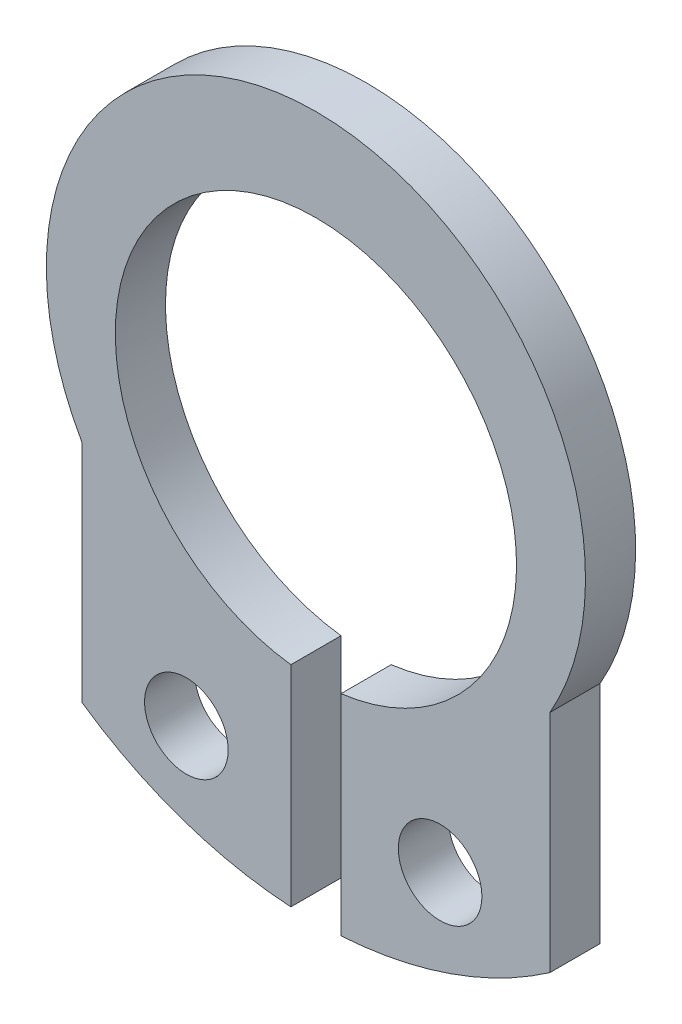
ISO-10303-21;
HEADER;
FILE_DESCRIPTION(('STEP AP214'),'2;1');
FILE_NAME('part.step','',(''),(''),'','','');
FILE_SCHEMA(('AUTOMOTIVE_DESIGN { 1 0 10303 214 1 1 1 1 }'));
ENDSEC;
DATA;
#1=APPLICATION_CONTEXT('core data for automotive mechanical design processes');
#2=APPLICATION_PROTOCOL_DEFINITION('international standard','automotive_design',2000,#1);
#3=PRODUCT_CONTEXT('',#1,'mechanical');
#4=PRODUCT('Part','Part','',(#3));
#5=PRODUCT_RELATED_PRODUCT_CATEGORY('part','',(#4));
#6=PRODUCT_DEFINITION_FORMATION('','',#4);
#7=PRODUCT_DEFINITION_CONTEXT('part definition',#1,'design');
#8=PRODUCT_DEFINITION('design','',#6,#7);
#9=PRODUCT_DEFINITION_SHAPE('','',#8);
#10=(LENGTH_UNIT() NAMED_UNIT(*) SI_UNIT(.MILLI.,.METRE.));
#11=(NAMED_UNIT(*) PLANE_ANGLE_UNIT() SI_UNIT($,.RADIAN.));
#12=(NAMED_UNIT(*) SI_UNIT($,.STERADIAN.) SOLID_ANGLE_UNIT());
#13=UNCERTAINTY_MEASURE_WITH_UNIT(LENGTH_MEASURE(1.E-05),#10,'distance_accuracy_value','');
#14=(GEOMETRIC_REPRESENTATION_CONTEXT(3) GLOBAL_UNCERTAINTY_ASSIGNED_CONTEXT((#13)) GLOBAL_UNIT_ASSIGNED_CONTEXT((#10,
#11,#12)) REPRESENTATION_CONTEXT('',''));
#15=CARTESIAN_POINT('',(0.,0.,0.));
#16=DIRECTION('',(0.,0.,1.));
#17=DIRECTION('',(1.,0.,0.));
#18=AXIS2_PLACEMENT_3D('',#15,#16,#17);
#19=CARTESIAN_POINT('',(0.153061224489797,1.55676256731012,0.));
#20=DIRECTION('',(0.,0.,1.));
#21=DIRECTION('',(1.,0.,0.));
#22=AXIS2_PLACEMENT_3D('',#19,#20,#21);
#23=PLANE('',#22);
#24=CARTESIAN_POINT('',(0.153061224489797,2.49531005319132,0.));
#25=DIRECTION('',(0.,0.,1.));
#26=DIRECTION('',(1.,0.,0.));
#27=AXIS2_PLACEMENT_3D('',#24,#25,#26);
#28=CIRCLE('',#27,2.4);
#29=CARTESIAN_POINT('',(0.453061224489797,0.114133873233191,0.));
#30=VERTEX_POINT('',#29);
#31=CARTESIAN_POINT('',(-0.146938775510204,0.114133873233191,0.));
#32=VERTEX_POINT('',#31);
#33=EDGE_CURVE('E10',#30,#32,#28,.T.);
#34=ORIENTED_EDGE('',*,*,#33,.T.);
#35=DIRECTION('',(0.,1.,0.));
#36=VECTOR('',#35,1.);
#37=CARTESIAN_POINT('',(-0.146938775510204,-2.39549765106367,0.));
#38=LINE('',#37,#36);
#39=CARTESIAN_POINT('',(-0.146938775510204,-2.39549765106367,0.));
#40=VERTEX_POINT('',#39);
#41=EDGE_CURVE('E120',#40,#32,#38,.T.);
#42=ORIENTED_EDGE('',*,*,#41,.F.);
#43=CARTESIAN_POINT('',(0.153061224489797,2.49531005319132,0.));
#44=DIRECTION('',(0.,0.,1.));
#45=DIRECTION('',(1.,0.,0.));
#46=AXIS2_PLACEMENT_3D('',#43,#44,#45);
#47=CIRCLE('',#46,4.9);
#48=CARTESIAN_POINT('',(-2.64693877551021,-1.5258837993853,0.));
#49=VERTEX_POINT('',#48);
#50=EDGE_CURVE('E107',#49,#40,#47,.T.);
#51=ORIENTED_EDGE('',*,*,#50,.F.);
#52=DIRECTION('',(0.,1.,0.));
#53=VECTOR('',#52,1.);
#54=CARTESIAN_POINT('',(-2.64693877551021,-1.5258837993853,0.));
#55=LINE('',#54,#53);
#56=CARTESIAN_POINT('',(-2.64693877551021,1.1701147526108,0.));
#57=VERTEX_POINT('',#56);
#58=EDGE_CURVE('E146',#49,#57,#55,.T.);
#59=ORIENTED_EDGE('',*,*,#58,.T.);
#60=CARTESIAN_POINT('',(0.153061224489797,2.77031005319132,0.));
#61=DIRECTION('',(0.,0.,1.));
#62=DIRECTION('',(1.,0.,0.));
#63=AXIS2_PLACEMENT_3D('',#60,#61,#62);
#64=CIRCLE('',#63,3.225);
#65=CARTESIAN_POINT('',(2.95306122448979,1.17011475261079,0.));
#66=VERTEX_POINT('',#65);
#67=EDGE_CURVE('E125',#66,#57,#64,.T.);
#68=ORIENTED_EDGE('',*,*,#67,.F.);
#69=DIRECTION('',(0.,1.,0.));
#70=VECTOR('',#69,1.);
#71=CARTESIAN_POINT('',(2.95306122448979,-1.52588379938531,0.));
#72=LINE('',#71,#70);
#73=CARTESIAN_POINT('',(2.95306122448979,-1.5258837993853,0.));
#74=VERTEX_POINT('',#73);
#75=EDGE_CURVE('E163',#74,#66,#72,.T.);
#76=ORIENTED_EDGE('',*,*,#75,.F.);
#77=CARTESIAN_POINT('',(0.153061224489797,2.49531005319132,0.));
#78=DIRECTION('',(0.,0.,1.));
#79=DIRECTION('',(1.,0.,0.));
#80=AXIS2_PLACEMENT_3D('',#77,#78,#79);
#81=CIRCLE('',#80,4.9);
#82=CARTESIAN_POINT('',(0.453061224489797,-2.39549765106367,0.));
#83=VERTEX_POINT('',#82);
#84=EDGE_CURVE('E174',#83,#74,#81,.T.);
#85=ORIENTED_EDGE('',*,*,#84,.F.);
#86=DIRECTION('',(0.,1.,0.));
#87=VECTOR('',#86,1.);
#88=CARTESIAN_POINT('',(0.453061224489797,-2.39549765106367,0.));
#89=LINE('',#88,#87);
#90=EDGE_CURVE('E184',#83,#30,#89,.T.);
#91=ORIENTED_EDGE('',*,*,#90,.T.);
#92=EDGE_LOOP('',(#34,#42,#51,#59,#68,#76,#85,#91));
#93=FACE_BOUND('',#92,.T.);
#94=CARTESIAN_POINT('',(-1.3969387755102,-1.14549765106367,0.));
#95=DIRECTION('',(0.,0.,1.));
#96=DIRECTION('',(1.,0.,0.));
#97=AXIS2_PLACEMENT_3D('',#94,#95,#96);
#98=CIRCLE('',#97,0.5);
#99=CARTESIAN_POINT('',(-0.896938775510204,-1.14549765106367,0.));
#100=VERTEX_POINT('',#99);
#101=EDGE_CURVE('E95',#100,#100,#98,.T.);
#102=ORIENTED_EDGE('',*,*,#101,.T.);
#103=EDGE_LOOP('',(#102));
#104=FACE_BOUND('',#103,.T.);
#105=CARTESIAN_POINT('',(1.63877551020408,-1.14549765106367,0.));
#106=DIRECTION('',(0.,0.,1.));
#107=DIRECTION('',(1.,0.,0.));
#108=AXIS2_PLACEMENT_3D('',#105,#106,#107);
#109=CIRCLE('',#108,0.5);
#110=CARTESIAN_POINT('',(2.13877551020408,-1.14549765106367,0.));
#111=VERTEX_POINT('',#110);
#112=EDGE_CURVE('E108',#111,#111,#109,.T.);
#113=ORIENTED_EDGE('',*,*,#112,.T.);
#114=EDGE_LOOP('',(#113));
#115=FACE_BOUND('',#114,.T.);
#116=ADVANCED_FACE('F16',(#93,#104,#115),#23,.F.);
#117=CARTESIAN_POINT('',(0.153061224489797,1.55676256731012,0.6));
#118=DIRECTION('',(0.,0.,1.));
#119=DIRECTION('',(1.,0.,0.));
#120=AXIS2_PLACEMENT_3D('',#117,#118,#119);
#121=PLANE('',#120);
#122=DIRECTION('',(0.,-1.,0.));
#123=VECTOR('',#122,1.);
#124=CARTESIAN_POINT('',(-0.146938775510204,-2.39549765106367,0.6));
#125=LINE('',#124,#123);
#126=CARTESIAN_POINT('',(-0.146938775510204,0.114133873233191,0.6));
#127=VERTEX_POINT('',#126);
#128=CARTESIAN_POINT('',(-0.146938775510204,-2.39549765106367,0.6));
#129=VERTEX_POINT('',#128);
#130=EDGE_CURVE('E94',#127,#129,#125,.T.);
#131=ORIENTED_EDGE('',*,*,#130,.F.);
#132=CARTESIAN_POINT('',(0.153061224489797,2.49531005319132,0.6));
#133=DIRECTION('',(0.,0.,1.));
#134=DIRECTION('',(1.,0.,0.));
#135=AXIS2_PLACEMENT_3D('',#132,#133,#134);
#136=CIRCLE('',#135,2.4);
#137=CARTESIAN_POINT('',(0.453061224489797,0.114133873233191,0.6));
#138=VERTEX_POINT('',#137);
#139=EDGE_CURVE('E25',#138,#127,#136,.T.);
#140=ORIENTED_EDGE('',*,*,#139,.F.);
#141=DIRECTION('',(0.,1.,0.));
#142=VECTOR('',#141,1.);
#143=CARTESIAN_POINT('',(0.453061224489797,-2.39549765106367,0.6));
#144=LINE('',#143,#142);
#145=CARTESIAN_POINT('',(0.453061224489797,-2.39549765106367,0.6));
#146=VERTEX_POINT('',#145);
#147=EDGE_CURVE('E177',#146,#138,#144,.T.);
#148=ORIENTED_EDGE('',*,*,#147,.F.);
#149=CARTESIAN_POINT('',(0.153061224489797,2.49531005319132,0.6));
#150=DIRECTION('',(0.,0.,-1.));
#151=DIRECTION('',(1.,0.,0.));
#152=AXIS2_PLACEMENT_3D('',#149,#150,#151);
#153=CIRCLE('',#152,4.9);
#154=CARTESIAN_POINT('',(2.95306122448979,-1.5258837993853,0.6));
#155=VERTEX_POINT('',#154);
#156=EDGE_CURVE('E166',#155,#146,#153,.T.);
#157=ORIENTED_EDGE('',*,*,#156,.F.);
#158=DIRECTION('',(0.,-1.,0.));
#159=VECTOR('',#158,1.);
#160=CARTESIAN_POINT('',(2.95306122448979,-1.52588379938531,0.6));
#161=LINE('',#160,#159);
#162=CARTESIAN_POINT('',(2.95306122448979,1.17011475261079,0.6));
#163=VERTEX_POINT('',#162);
#164=EDGE_CURVE('E155',#163,#155,#161,.T.);
#165=ORIENTED_EDGE('',*,*,#164,.F.);
#166=CARTESIAN_POINT('',(0.153061224489797,2.77031005319132,0.6));
#167=DIRECTION('',(0.,0.,-1.));
#168=DIRECTION('',(1.,0.,0.));
#169=AXIS2_PLACEMENT_3D('',#166,#167,#168);
#170=CIRCLE('',#169,3.225);
#171=CARTESIAN_POINT('',(-2.64693877551021,1.1701147526108,0.6));
#172=VERTEX_POINT('',#171);
#173=EDGE_CURVE('E126',#172,#163,#170,.T.);
#174=ORIENTED_EDGE('',*,*,#173,.F.);
#175=DIRECTION('',(0.,1.,0.));
#176=VECTOR('',#175,1.);
#177=CARTESIAN_POINT('',(-2.64693877551021,-1.5258837993853,0.6));
#178=LINE('',#177,#176);
#179=CARTESIAN_POINT('',(-2.64693877551021,-1.5258837993853,0.6));
#180=VERTEX_POINT('',#179);
#181=EDGE_CURVE('E111',#180,#172,#178,.T.);
#182=ORIENTED_EDGE('',*,*,#181,.F.);
#183=CARTESIAN_POINT('',(0.153061224489797,2.49531005319132,0.6));
#184=DIRECTION('',(0.,0.,-1.));
#185=DIRECTION('',(1.,0.,0.));
#186=AXIS2_PLACEMENT_3D('',#183,#184,#185);
#187=CIRCLE('',#186,4.9);
#188=EDGE_CURVE('E135',#129,#180,#187,.T.);
#189=ORIENTED_EDGE('',*,*,#188,.F.);
#190=EDGE_LOOP('',(#131,#140,#148,#157,#165,#174,#182,#189));
#191=FACE_BOUND('',#190,.T.);
#192=CARTESIAN_POINT('',(-1.3969387755102,-1.14549765106367,0.6));
#193=DIRECTION('',(0.,0.,-1.));
#194=DIRECTION('',(1.,0.,0.));
#195=AXIS2_PLACEMENT_3D('',#192,#193,#194);
#196=CIRCLE('',#195,0.5);
#197=CARTESIAN_POINT('',(-0.896938775510204,-1.14549765106367,0.6));
#198=VERTEX_POINT('',#197);
#199=EDGE_CURVE('E90',#198,#198,#196,.T.);
#200=ORIENTED_EDGE('',*,*,#199,.T.);
#201=EDGE_LOOP('',(#200));
#202=FACE_BOUND('',#201,.T.);
#203=CARTESIAN_POINT('',(1.63877551020408,-1.14549765106367,0.6));
#204=DIRECTION('',(0.,0.,-1.));
#205=DIRECTION('',(1.,0.,0.));
#206=AXIS2_PLACEMENT_3D('',#203,#204,#205);
#207=CIRCLE('',#206,0.5);
#208=CARTESIAN_POINT('',(2.13877551020408,-1.14549765106367,0.6));
#209=VERTEX_POINT('',#208);
#210=EDGE_CURVE('E103',#209,#209,#207,.T.);
#211=ORIENTED_EDGE('',*,*,#210,.T.);
#212=EDGE_LOOP('',(#211));
#213=FACE_BOUND('',#212,.T.);
#214=ADVANCED_FACE('F18',(#191,#202,#213),#121,.T.);
#215=CARTESIAN_POINT('',(0.153061224489797,2.49531005319132,0.));
#216=DIRECTION('',(0.,0.,-1.));
#217=DIRECTION('',(1.,0.,0.));
#218=AXIS2_PLACEMENT_3D('',#215,#216,#217);
#219=CYLINDRICAL_SURFACE('',#218,2.4);
#220=ORIENTED_EDGE('',*,*,#139,.T.);
#221=DIRECTION('',(0.,0.,1.));
#222=VECTOR('',#221,1.);
#223=CARTESIAN_POINT('',(-0.146938775510204,0.114133873233191,0.));
#224=LINE('',#223,#222);
#225=EDGE_CURVE('E131',#32,#127,#224,.T.);
#226=ORIENTED_EDGE('',*,*,#225,.F.);
#227=ORIENTED_EDGE('',*,*,#33,.F.);
#228=DIRECTION('',(0.,0.,1.));
#229=VECTOR('',#228,1.);
#230=CARTESIAN_POINT('',(0.453061224489797,0.114133873233191,0.));
#231=LINE('',#230,#229);
#232=EDGE_CURVE('E181',#30,#138,#231,.T.);
#233=ORIENTED_EDGE('',*,*,#232,.T.);
#234=EDGE_LOOP('',(#220,#226,#227,#233));
#235=FACE_BOUND('',#234,.T.);
#236=ADVANCED_FACE('F187',(#235),#219,.F.);
#237=CARTESIAN_POINT('',(0.453061224489797,-1.14068188891524,0.));
#238=DIRECTION('',(-1.,0.,0.));
#239=DIRECTION('',(0.,-1.,0.));
#240=AXIS2_PLACEMENT_3D('',#237,#238,#239);
#241=PLANE('',#240);
#242=ORIENTED_EDGE('',*,*,#147,.T.);
#243=ORIENTED_EDGE('',*,*,#232,.F.);
#244=ORIENTED_EDGE('',*,*,#90,.F.);
#245=DIRECTION('',(0.,0.,1.));
#246=VECTOR('',#245,1.);
#247=CARTESIAN_POINT('',(0.453061224489797,-2.39549765106367,0.));
#248=LINE('',#247,#246);
#249=EDGE_CURVE('E170',#83,#146,#248,.T.);
#250=ORIENTED_EDGE('',*,*,#249,.T.);
#251=EDGE_LOOP('',(#242,#243,#244,#250));
#252=FACE_BOUND('',#251,.T.);
#253=ADVANCED_FACE('F204',(#252),#241,.T.);
#254=CARTESIAN_POINT('',(0.153061224489797,2.49531005319132,0.));
#255=DIRECTION('',(0.,0.,-1.));
#256=DIRECTION('',(1.,0.,0.));
#257=AXIS2_PLACEMENT_3D('',#254,#255,#256);
#258=CYLINDRICAL_SURFACE('',#257,4.9);
#259=ORIENTED_EDGE('',*,*,#156,.T.);
#260=ORIENTED_EDGE('',*,*,#249,.F.);
#261=ORIENTED_EDGE('',*,*,#84,.T.);
#262=DIRECTION('',(0.,0.,1.));
#263=VECTOR('',#262,1.);
#264=CARTESIAN_POINT('',(2.95306122448979,-1.5258837993853,0.));
#265=LINE('',#264,#263);
#266=EDGE_CURVE('E159',#74,#155,#265,.T.);
#267=ORIENTED_EDGE('',*,*,#266,.T.);
#268=EDGE_LOOP('',(#259,#260,#261,#267));
#269=FACE_BOUND('',#268,.T.);
#270=ADVANCED_FACE('F207',(#269),#258,.T.);
#271=CARTESIAN_POINT('',(2.95306122448979,-0.177884523387254,0.));
#272=DIRECTION('',(1.,0.,0.));
#273=DIRECTION('',(0.,1.,0.));
#274=AXIS2_PLACEMENT_3D('',#271,#272,#273);
#275=PLANE('',#274);
#276=ORIENTED_EDGE('',*,*,#164,.T.);
#277=ORIENTED_EDGE('',*,*,#266,.F.);
#278=ORIENTED_EDGE('',*,*,#75,.T.);
#279=DIRECTION('',(0.,0.,1.));
#280=VECTOR('',#279,1.);
#281=CARTESIAN_POINT('',(2.95306122448979,1.17011475261079,0.));
#282=LINE('',#281,#280);
#283=EDGE_CURVE('E122',#66,#163,#282,.T.);
#284=ORIENTED_EDGE('',*,*,#283,.T.);
#285=EDGE_LOOP('',(#276,#277,#278,#284));
#286=FACE_BOUND('',#285,.T.);
#287=ADVANCED_FACE('F209',(#286),#275,.T.);
#288=CARTESIAN_POINT('',(0.153061224489797,2.77031005319132,0.));
#289=DIRECTION('',(0.,0.,-1.));
#290=DIRECTION('',(1.,0.,0.));
#291=AXIS2_PLACEMENT_3D('',#288,#289,#290);
#292=CYLINDRICAL_SURFACE('',#291,3.225);
#293=ORIENTED_EDGE('',*,*,#173,.T.);
#294=ORIENTED_EDGE('',*,*,#283,.F.);
#295=ORIENTED_EDGE('',*,*,#67,.T.);
#296=DIRECTION('',(0.,0.,1.));
#297=VECTOR('',#296,1.);
#298=CARTESIAN_POINT('',(-2.64693877551021,1.1701147526108,0.));
#299=LINE('',#298,#297);
#300=EDGE_CURVE('E115',#57,#172,#299,.T.);
#301=ORIENTED_EDGE('',*,*,#300,.T.);
#302=EDGE_LOOP('',(#293,#294,#295,#301));
#303=FACE_BOUND('',#302,.T.);
#304=ADVANCED_FACE('F213',(#303),#292,.T.);
#305=CARTESIAN_POINT('',(-2.64693877551021,-0.177884523387248,0.));
#306=DIRECTION('',(-1.,0.,0.));
#307=DIRECTION('',(0.,-1.,0.));
#308=AXIS2_PLACEMENT_3D('',#305,#306,#307);
#309=PLANE('',#308);
#310=ORIENTED_EDGE('',*,*,#181,.T.);
#311=ORIENTED_EDGE('',*,*,#300,.F.);
#312=ORIENTED_EDGE('',*,*,#58,.F.);
#313=DIRECTION('',(0.,0.,1.));
#314=VECTOR('',#313,1.);
#315=CARTESIAN_POINT('',(-2.64693877551021,-1.5258837993853,0.));
#316=LINE('',#315,#314);
#317=EDGE_CURVE('E139',#49,#180,#316,.T.);
#318=ORIENTED_EDGE('',*,*,#317,.T.);
#319=EDGE_LOOP('',(#310,#311,#312,#318));
#320=FACE_BOUND('',#319,.T.);
#321=ADVANCED_FACE('F216',(#320),#309,.T.);
#322=CARTESIAN_POINT('',(0.153061224489797,2.49531005319132,0.));
#323=DIRECTION('',(0.,0.,-1.));
#324=DIRECTION('',(1.,0.,0.));
#325=AXIS2_PLACEMENT_3D('',#322,#323,#324);
#326=CYLINDRICAL_SURFACE('',#325,4.9);
#327=ORIENTED_EDGE('',*,*,#188,.T.);
#328=ORIENTED_EDGE('',*,*,#317,.F.);
#329=ORIENTED_EDGE('',*,*,#50,.T.);
#330=DIRECTION('',(0.,0.,1.));
#331=VECTOR('',#330,1.);
#332=CARTESIAN_POINT('',(-0.146938775510204,-2.39549765106367,0.));
#333=LINE('',#332,#331);
#334=EDGE_CURVE('E101',#40,#129,#333,.T.);
#335=ORIENTED_EDGE('',*,*,#334,.T.);
#336=EDGE_LOOP('',(#327,#328,#329,#335));
#337=FACE_BOUND('',#336,.T.);
#338=ADVANCED_FACE('F195',(#337),#326,.T.);
#339=CARTESIAN_POINT('',(-0.146938775510204,-1.14068188891524,0.));
#340=DIRECTION('',(1.,0.,0.));
#341=DIRECTION('',(0.,1.,0.));
#342=AXIS2_PLACEMENT_3D('',#339,#340,#341);
#343=PLANE('',#342);
#344=ORIENTED_EDGE('',*,*,#130,.T.);
#345=ORIENTED_EDGE('',*,*,#334,.F.);
#346=ORIENTED_EDGE('',*,*,#41,.T.);
#347=ORIENTED_EDGE('',*,*,#225,.T.);
#348=EDGE_LOOP('',(#344,#345,#346,#347));
#349=FACE_BOUND('',#348,.T.);
#350=ADVANCED_FACE('F190',(#349),#343,.T.);
#351=CARTESIAN_POINT('',(-1.3969387755102,-1.14549765106367,0.3));
#352=DIRECTION('',(0.,0.,-1.));
#353=DIRECTION('',(1.,0.,0.));
#354=AXIS2_PLACEMENT_3D('',#351,#352,#353);
#355=CYLINDRICAL_SURFACE('',#354,0.5);
#356=ORIENTED_EDGE('',*,*,#199,.F.);
#357=EDGE_LOOP('',(#356));
#358=FACE_BOUND('',#357,.T.);
#359=ORIENTED_EDGE('',*,*,#101,.F.);
#360=EDGE_LOOP('',(#359));
#361=FACE_BOUND('',#360,.T.);
#362=ADVANCED_FACE('F244',(#358,#361),#355,.F.);
#363=CARTESIAN_POINT('',(1.63877551020408,-1.14549765106367,0.3));
#364=DIRECTION('',(0.,0.,-1.));
#365=DIRECTION('',(1.,0.,0.));
#366=AXIS2_PLACEMENT_3D('',#363,#364,#365);
#367=CYLINDRICAL_SURFACE('',#366,0.5);
#368=ORIENTED_EDGE('',*,*,#210,.F.);
#369=EDGE_LOOP('',(#368));
#370=FACE_BOUND('',#369,.T.);
#371=ORIENTED_EDGE('',*,*,#112,.F.);
#372=EDGE_LOOP('',(#371));
#373=FACE_BOUND('',#372,.T.);
#374=ADVANCED_FACE('F250',(#370,#373),#367,.F.);
#375=CLOSED_SHELL('',(#116,#214,#236,#253,#270,#287,#304,#321,#338,#350,#362,#374));
#376=MANIFOLD_SOLID_BREP('B1',#375);
#377=ADVANCED_BREP_SHAPE_REPRESENTATION('',(#18,#376),#14);
#378=SHAPE_DEFINITION_REPRESENTATION(#9,#377);
ENDSEC;
END-ISO-10303-21;
